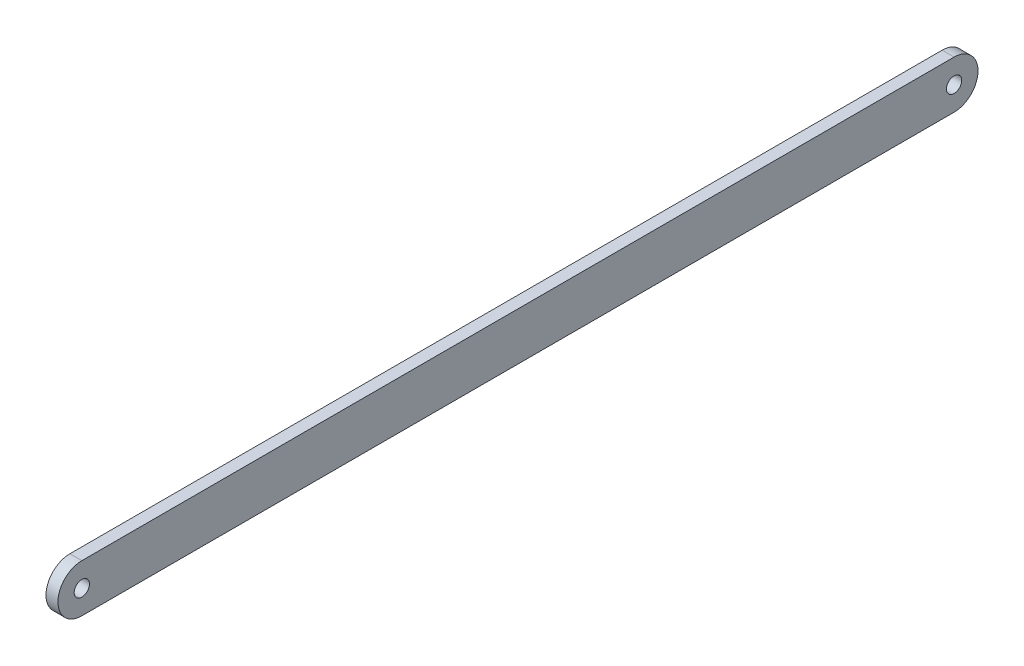
ISO-10303-21;
HEADER;
FILE_DESCRIPTION(('STEP AP214'),'2;1');
FILE_NAME('part.step','',(''),(''),'','','');
FILE_SCHEMA(('AUTOMOTIVE_DESIGN { 1 0 10303 214 1 1 1 1 }'));
ENDSEC;
DATA;
#1=APPLICATION_CONTEXT('core data for automotive mechanical design processes');
#2=APPLICATION_PROTOCOL_DEFINITION('international standard','automotive_design',2000,#1);
#3=PRODUCT_CONTEXT('',#1,'mechanical');
#4=PRODUCT('Part','Part','',(#3));
#5=PRODUCT_RELATED_PRODUCT_CATEGORY('part','',(#4));
#6=PRODUCT_DEFINITION_FORMATION('','',#4);
#7=PRODUCT_DEFINITION_CONTEXT('part definition',#1,'design');
#8=PRODUCT_DEFINITION('design','',#6,#7);
#9=PRODUCT_DEFINITION_SHAPE('','',#8);
#10=(LENGTH_UNIT() NAMED_UNIT(*) SI_UNIT(.MILLI.,.METRE.));
#11=(NAMED_UNIT(*) PLANE_ANGLE_UNIT() SI_UNIT($,.RADIAN.));
#12=(NAMED_UNIT(*) SI_UNIT($,.STERADIAN.) SOLID_ANGLE_UNIT());
#13=UNCERTAINTY_MEASURE_WITH_UNIT(LENGTH_MEASURE(1.E-05),#10,'distance_accuracy_value','');
#14=(GEOMETRIC_REPRESENTATION_CONTEXT(3) GLOBAL_UNCERTAINTY_ASSIGNED_CONTEXT((#13)) GLOBAL_UNIT_ASSIGNED_CONTEXT((#10,
#11,#12)) REPRESENTATION_CONTEXT('',''));
#15=CARTESIAN_POINT('',(0.,0.,0.));
#16=DIRECTION('',(0.,0.,1.));
#17=DIRECTION('',(1.,0.,0.));
#18=AXIS2_PLACEMENT_3D('',#15,#16,#17);
#19=CARTESIAN_POINT('',(3.175,0.,0.));
#20=DIRECTION('',(1.,0.,0.));
#21=DIRECTION('',(0.,0.,-1.));
#22=AXIS2_PLACEMENT_3D('',#19,#20,#21);
#23=PLANE('',#22);
#24=CARTESIAN_POINT('',(3.175,0.,231.775));
#25=DIRECTION('',(1.,0.,0.));
#26=DIRECTION('',(0.,0.,-1.));
#27=AXIS2_PLACEMENT_3D('',#24,#25,#26);
#28=CIRCLE('',#27,2.03200000000001);
#29=CARTESIAN_POINT('',(3.175,0.,229.743));
#30=VERTEX_POINT('',#29);
#31=EDGE_CURVE('E126',#30,#30,#28,.T.);
#32=ORIENTED_EDGE('',*,*,#31,.F.);
#33=EDGE_LOOP('',(#32));
#34=FACE_BOUND('',#33,.T.);
#35=CARTESIAN_POINT('',(3.175,0.,0.));
#36=DIRECTION('',(1.,0.,0.));
#37=DIRECTION('',(0.,0.,-1.));
#38=AXIS2_PLACEMENT_3D('',#35,#36,#37);
#39=CIRCLE('',#38,6.35);
#40=CARTESIAN_POINT('',(3.175,-6.35,0.));
#41=VERTEX_POINT('',#40);
#42=CARTESIAN_POINT('',(3.175,6.35,0.));
#43=VERTEX_POINT('',#42);
#44=EDGE_CURVE('E104',#41,#43,#39,.T.);
#45=ORIENTED_EDGE('',*,*,#44,.T.);
#46=DIRECTION('',(0.,0.,1.));
#47=VECTOR('',#46,1.);
#48=CARTESIAN_POINT('',(3.175,6.35,0.));
#49=LINE('',#48,#47);
#50=CARTESIAN_POINT('',(3.175,6.34999999999997,231.775));
#51=VERTEX_POINT('',#50);
#52=EDGE_CURVE('E99',#43,#51,#49,.T.);
#53=ORIENTED_EDGE('',*,*,#52,.T.);
#54=CARTESIAN_POINT('',(3.175,0.,231.775));
#55=DIRECTION('',(1.,0.,0.));
#56=DIRECTION('',(0.,0.,-1.));
#57=AXIS2_PLACEMENT_3D('',#54,#55,#56);
#58=CIRCLE('',#57,6.35);
#59=CARTESIAN_POINT('',(3.175,-6.35000000000003,231.775));
#60=VERTEX_POINT('',#59);
#61=EDGE_CURVE('E102',#51,#60,#58,.T.);
#62=ORIENTED_EDGE('',*,*,#61,.T.);
#63=DIRECTION('',(0.,0.,-1.));
#64=VECTOR('',#63,1.);
#65=CARTESIAN_POINT('',(3.175,-6.35,0.));
#66=LINE('',#65,#64);
#67=EDGE_CURVE('E63',#60,#41,#66,.T.);
#68=ORIENTED_EDGE('',*,*,#67,.T.);
#69=EDGE_LOOP('',(#45,#53,#62,#68));
#70=FACE_BOUND('',#69,.T.);
#71=CARTESIAN_POINT('',(3.175,0.,0.));
#72=DIRECTION('',(1.,0.,0.));
#73=DIRECTION('',(0.,0.,-1.));
#74=AXIS2_PLACEMENT_3D('',#71,#72,#73);
#75=CIRCLE('',#74,2.032);
#76=CARTESIAN_POINT('',(3.175,0.,-2.032));
#77=VERTEX_POINT('',#76);
#78=EDGE_CURVE('E146',#77,#77,#75,.T.);
#79=ORIENTED_EDGE('',*,*,#78,.F.);
#80=EDGE_LOOP('',(#79));
#81=FACE_BOUND('',#80,.T.);
#82=ADVANCED_FACE('F45',(#34,#70,#81),#23,.T.);
#83=CARTESIAN_POINT('',(0.,0.,0.));
#84=DIRECTION('',(1.,0.,0.));
#85=DIRECTION('',(0.,0.,-1.));
#86=AXIS2_PLACEMENT_3D('',#83,#84,#85);
#87=PLANE('',#86);
#88=CARTESIAN_POINT('',(0.,0.,0.));
#89=DIRECTION('',(1.,0.,0.));
#90=DIRECTION('',(0.,0.,-1.));
#91=AXIS2_PLACEMENT_3D('',#88,#89,#90);
#92=CIRCLE('',#91,6.35);
#93=CARTESIAN_POINT('',(0.,-6.35,0.));
#94=VERTEX_POINT('',#93);
#95=CARTESIAN_POINT('',(0.,6.35,0.));
#96=VERTEX_POINT('',#95);
#97=EDGE_CURVE('E122',#94,#96,#92,.T.);
#98=ORIENTED_EDGE('',*,*,#97,.F.);
#99=DIRECTION('',(0.,0.,-1.));
#100=VECTOR('',#99,1.);
#101=CARTESIAN_POINT('',(0.,-6.35,0.));
#102=LINE('',#101,#100);
#103=CARTESIAN_POINT('',(0.,-6.35000000000003,231.775));
#104=VERTEX_POINT('',#103);
#105=EDGE_CURVE('E91',#104,#94,#102,.T.);
#106=ORIENTED_EDGE('',*,*,#105,.F.);
#107=CARTESIAN_POINT('',(0.,0.,231.775));
#108=DIRECTION('',(1.,0.,0.));
#109=DIRECTION('',(0.,0.,-1.));
#110=AXIS2_PLACEMENT_3D('',#107,#108,#109);
#111=CIRCLE('',#110,6.35);
#112=CARTESIAN_POINT('',(0.,6.34999999999997,231.775));
#113=VERTEX_POINT('',#112);
#114=EDGE_CURVE('E85',#113,#104,#111,.T.);
#115=ORIENTED_EDGE('',*,*,#114,.F.);
#116=DIRECTION('',(0.,0.,1.));
#117=VECTOR('',#116,1.);
#118=CARTESIAN_POINT('',(0.,6.35,0.));
#119=LINE('',#118,#117);
#120=EDGE_CURVE('E109',#96,#113,#119,.T.);
#121=ORIENTED_EDGE('',*,*,#120,.F.);
#122=EDGE_LOOP('',(#98,#106,#115,#121));
#123=FACE_BOUND('',#122,.T.);
#124=CARTESIAN_POINT('',(0.,0.,231.775));
#125=DIRECTION('',(1.,0.,0.));
#126=DIRECTION('',(0.,0.,-1.));
#127=AXIS2_PLACEMENT_3D('',#124,#125,#126);
#128=CIRCLE('',#127,2.03200000000001);
#129=CARTESIAN_POINT('',(0.,0.,229.743));
#130=VERTEX_POINT('',#129);
#131=EDGE_CURVE('E143',#130,#130,#128,.T.);
#132=ORIENTED_EDGE('',*,*,#131,.T.);
#133=EDGE_LOOP('',(#132));
#134=FACE_BOUND('',#133,.T.);
#135=CARTESIAN_POINT('',(0.,0.,0.));
#136=DIRECTION('',(1.,0.,0.));
#137=DIRECTION('',(0.,0.,-1.));
#138=AXIS2_PLACEMENT_3D('',#135,#136,#137);
#139=CIRCLE('',#138,2.032);
#140=CARTESIAN_POINT('',(0.,0.,-2.032));
#141=VERTEX_POINT('',#140);
#142=EDGE_CURVE('E149',#141,#141,#139,.T.);
#143=ORIENTED_EDGE('',*,*,#142,.T.);
#144=EDGE_LOOP('',(#143));
#145=FACE_BOUND('',#144,.T.);
#146=ADVANCED_FACE('F138',(#123,#134,#145),#87,.F.);
#147=CARTESIAN_POINT('',(3.175,0.,0.));
#148=DIRECTION('',(-1.,0.,0.));
#149=DIRECTION('',(0.,0.,1.));
#150=AXIS2_PLACEMENT_3D('',#147,#148,#149);
#151=CYLINDRICAL_SURFACE('',#150,6.35);
#152=ORIENTED_EDGE('',*,*,#97,.T.);
#153=DIRECTION('',(-1.,0.,0.));
#154=VECTOR('',#153,1.);
#155=CARTESIAN_POINT('',(3.175,6.35,0.));
#156=LINE('',#155,#154);
#157=EDGE_CURVE('E11',#43,#96,#156,.T.);
#158=ORIENTED_EDGE('',*,*,#157,.F.);
#159=ORIENTED_EDGE('',*,*,#44,.F.);
#160=DIRECTION('',(-1.,0.,0.));
#161=VECTOR('',#160,1.);
#162=CARTESIAN_POINT('',(3.175,-6.35,0.));
#163=LINE('',#162,#161);
#164=EDGE_CURVE('E118',#41,#94,#163,.T.);
#165=ORIENTED_EDGE('',*,*,#164,.T.);
#166=EDGE_LOOP('',(#152,#158,#159,#165));
#167=FACE_BOUND('',#166,.T.);
#168=ADVANCED_FACE('F47',(#167),#151,.T.);
#169=CARTESIAN_POINT('',(3.175,6.35,0.));
#170=DIRECTION('',(0.,-1.,0.));
#171=DIRECTION('',(0.,0.,-1.));
#172=AXIS2_PLACEMENT_3D('',#169,#170,#171);
#173=PLANE('',#172);
#174=ORIENTED_EDGE('',*,*,#120,.T.);
#175=DIRECTION('',(-1.,0.,0.));
#176=VECTOR('',#175,1.);
#177=CARTESIAN_POINT('',(3.175,6.34999999999997,231.775));
#178=LINE('',#177,#176);
#179=EDGE_CURVE('E55',#51,#113,#178,.T.);
#180=ORIENTED_EDGE('',*,*,#179,.F.);
#181=ORIENTED_EDGE('',*,*,#52,.F.);
#182=ORIENTED_EDGE('',*,*,#157,.T.);
#183=EDGE_LOOP('',(#174,#180,#181,#182));
#184=FACE_BOUND('',#183,.T.);
#185=ADVANCED_FACE('F108',(#184),#173,.F.);
#186=CARTESIAN_POINT('',(3.175,0.,231.775));
#187=DIRECTION('',(-1.,0.,0.));
#188=DIRECTION('',(0.,0.,1.));
#189=AXIS2_PLACEMENT_3D('',#186,#187,#188);
#190=CYLINDRICAL_SURFACE('',#189,6.35);
#191=ORIENTED_EDGE('',*,*,#114,.T.);
#192=DIRECTION('',(-1.,0.,0.));
#193=VECTOR('',#192,1.);
#194=CARTESIAN_POINT('',(3.175,-6.35000000000003,231.775));
#195=LINE('',#194,#193);
#196=EDGE_CURVE('E111',#60,#104,#195,.T.);
#197=ORIENTED_EDGE('',*,*,#196,.F.);
#198=ORIENTED_EDGE('',*,*,#61,.F.);
#199=ORIENTED_EDGE('',*,*,#179,.T.);
#200=EDGE_LOOP('',(#191,#197,#198,#199));
#201=FACE_BOUND('',#200,.T.);
#202=ADVANCED_FACE('F112',(#201),#190,.T.);
#203=CARTESIAN_POINT('',(3.175,-6.35,0.));
#204=DIRECTION('',(0.,1.,0.));
#205=DIRECTION('',(0.,0.,1.));
#206=AXIS2_PLACEMENT_3D('',#203,#204,#205);
#207=PLANE('',#206);
#208=ORIENTED_EDGE('',*,*,#105,.T.);
#209=ORIENTED_EDGE('',*,*,#164,.F.);
#210=ORIENTED_EDGE('',*,*,#67,.F.);
#211=ORIENTED_EDGE('',*,*,#196,.T.);
#212=EDGE_LOOP('',(#208,#209,#210,#211));
#213=FACE_BOUND('',#212,.T.);
#214=ADVANCED_FACE('F135',(#213),#207,.F.);
#215=CARTESIAN_POINT('',(3.175,0.,231.775));
#216=DIRECTION('',(-1.,0.,0.));
#217=DIRECTION('',(0.,0.,1.));
#218=AXIS2_PLACEMENT_3D('',#215,#216,#217);
#219=CYLINDRICAL_SURFACE('',#218,2.03200000000001);
#220=ORIENTED_EDGE('',*,*,#31,.T.);
#221=EDGE_LOOP('',(#220));
#222=FACE_BOUND('',#221,.T.);
#223=ORIENTED_EDGE('',*,*,#131,.F.);
#224=EDGE_LOOP('',(#223));
#225=FACE_BOUND('',#224,.T.);
#226=ADVANCED_FACE('F167',(#222,#225),#219,.F.);
#227=CARTESIAN_POINT('',(3.175,0.,0.));
#228=DIRECTION('',(-1.,0.,0.));
#229=DIRECTION('',(0.,0.,1.));
#230=AXIS2_PLACEMENT_3D('',#227,#228,#229);
#231=CYLINDRICAL_SURFACE('',#230,2.032);
#232=ORIENTED_EDGE('',*,*,#78,.T.);
#233=EDGE_LOOP('',(#232));
#234=FACE_BOUND('',#233,.T.);
#235=ORIENTED_EDGE('',*,*,#142,.F.);
#236=EDGE_LOOP('',(#235));
#237=FACE_BOUND('',#236,.T.);
#238=ADVANCED_FACE('F157',(#234,#237),#231,.F.);
#239=CLOSED_SHELL('',(#82,#146,#168,#185,#202,#214,#226,#238));
#240=MANIFOLD_SOLID_BREP('B2',#239);
#241=ADVANCED_BREP_SHAPE_REPRESENTATION('',(#18,#240),#14);
#242=SHAPE_DEFINITION_REPRESENTATION(#9,#241);
ENDSEC;
END-ISO-10303-21;
